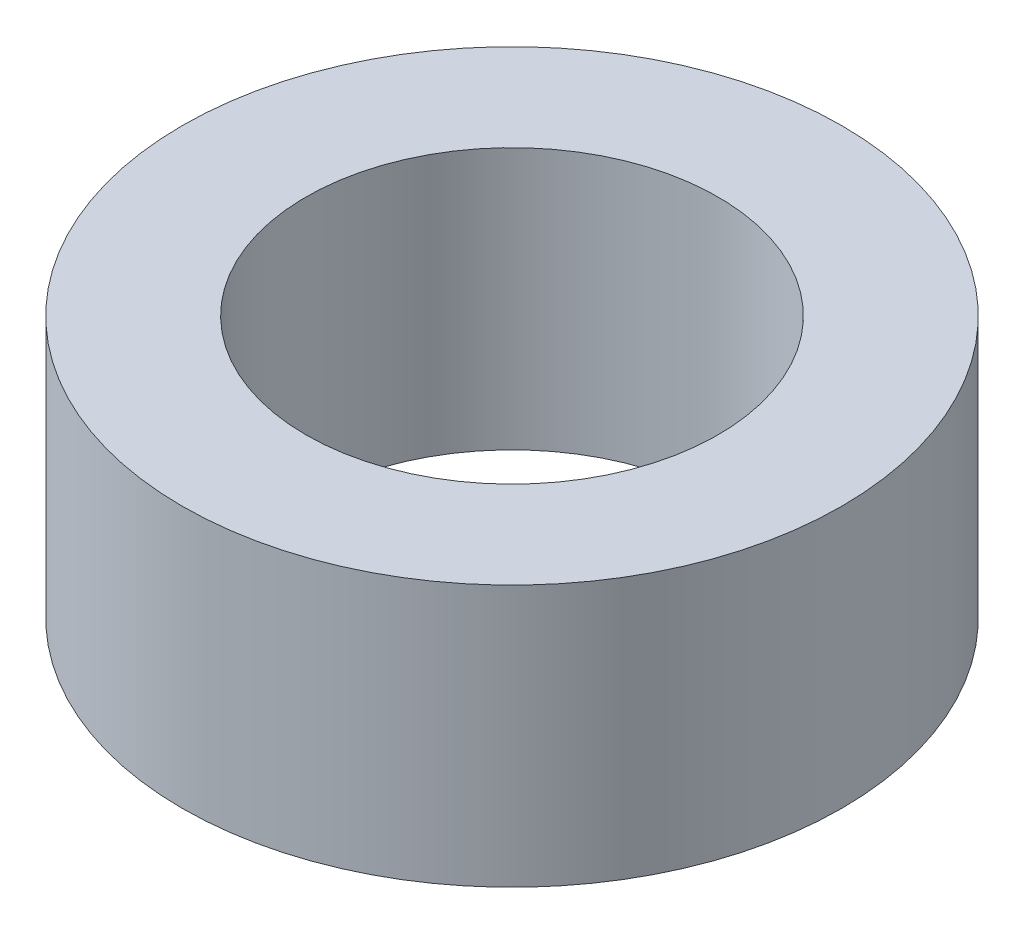
ISO-10303-21;
HEADER;
FILE_DESCRIPTION(('STEP AP214'),'2;1');
FILE_NAME('part.step','',(''),(''),'','','');
FILE_SCHEMA(('AUTOMOTIVE_DESIGN { 1 0 10303 214 1 1 1 1 }'));
ENDSEC;
DATA;
#1=APPLICATION_CONTEXT('core data for automotive mechanical design processes');
#2=APPLICATION_PROTOCOL_DEFINITION('international standard','automotive_design',2000,#1);
#3=PRODUCT_CONTEXT('',#1,'mechanical');
#4=PRODUCT('Part','Part','',(#3));
#5=PRODUCT_RELATED_PRODUCT_CATEGORY('part','',(#4));
#6=PRODUCT_DEFINITION_FORMATION('','',#4);
#7=PRODUCT_DEFINITION_CONTEXT('part definition',#1,'design');
#8=PRODUCT_DEFINITION('design','',#6,#7);
#9=PRODUCT_DEFINITION_SHAPE('','',#8);
#10=(LENGTH_UNIT() NAMED_UNIT(*) SI_UNIT(.MILLI.,.METRE.));
#11=(NAMED_UNIT(*) PLANE_ANGLE_UNIT() SI_UNIT($,.RADIAN.));
#12=(NAMED_UNIT(*) SI_UNIT($,.STERADIAN.) SOLID_ANGLE_UNIT());
#13=UNCERTAINTY_MEASURE_WITH_UNIT(LENGTH_MEASURE(1.E-05),#10,'distance_accuracy_value','');
#14=(GEOMETRIC_REPRESENTATION_CONTEXT(3) GLOBAL_UNCERTAINTY_ASSIGNED_CONTEXT((#13)) GLOBAL_UNIT_ASSIGNED_CONTEXT((#10,
#11,#12)) REPRESENTATION_CONTEXT('',''));
#15=CARTESIAN_POINT('',(0.,0.,0.));
#16=DIRECTION('',(0.,0.,1.));
#17=DIRECTION('',(1.,0.,0.));
#18=AXIS2_PLACEMENT_3D('',#15,#16,#17);
#19=CARTESIAN_POINT('',(0.,3.175,0.));
#20=DIRECTION('',(0.,1.,0.));
#21=DIRECTION('',(0.,0.,1.));
#22=AXIS2_PLACEMENT_3D('',#19,#20,#21);
#23=PLANE('',#22);
#24=CARTESIAN_POINT('',(0.,3.175,0.));
#25=DIRECTION('',(0.,1.,0.));
#26=DIRECTION('',(0.,0.,1.));
#27=AXIS2_PLACEMENT_3D('',#24,#25,#26);
#28=CIRCLE('',#27,4.);
#29=CARTESIAN_POINT('',(0.,3.175,4.));
#30=VERTEX_POINT('',#29);
#31=EDGE_CURVE('E10',#30,#30,#28,.T.);
#32=ORIENTED_EDGE('',*,*,#31,.T.);
#33=EDGE_LOOP('',(#32));
#34=FACE_BOUND('',#33,.T.);
#35=CARTESIAN_POINT('',(0.,3.175,0.));
#36=DIRECTION('',(0.,1.,0.));
#37=DIRECTION('',(0.,0.,1.));
#38=AXIS2_PLACEMENT_3D('',#35,#36,#37);
#39=CIRCLE('',#38,2.5);
#40=CARTESIAN_POINT('',(0.,3.175,2.5));
#41=VERTEX_POINT('',#40);
#42=EDGE_CURVE('E44',#41,#41,#39,.T.);
#43=ORIENTED_EDGE('',*,*,#42,.F.);
#44=EDGE_LOOP('',(#43));
#45=FACE_BOUND('',#44,.T.);
#46=ADVANCED_FACE('F33',(#34,#45),#23,.T.);
#47=CARTESIAN_POINT('',(0.,0.,0.));
#48=DIRECTION('',(0.,1.,0.));
#49=DIRECTION('',(0.,0.,1.));
#50=AXIS2_PLACEMENT_3D('',#47,#48,#49);
#51=PLANE('',#50);
#52=CARTESIAN_POINT('',(0.,0.,0.));
#53=DIRECTION('',(0.,1.,0.));
#54=DIRECTION('',(0.,0.,1.));
#55=AXIS2_PLACEMENT_3D('',#52,#53,#54);
#56=CIRCLE('',#55,4.);
#57=CARTESIAN_POINT('',(0.,0.,4.));
#58=VERTEX_POINT('',#57);
#59=EDGE_CURVE('E37',#58,#58,#56,.T.);
#60=ORIENTED_EDGE('',*,*,#59,.F.);
#61=EDGE_LOOP('',(#60));
#62=FACE_BOUND('',#61,.T.);
#63=CARTESIAN_POINT('',(0.,0.,0.));
#64=DIRECTION('',(0.,1.,0.));
#65=DIRECTION('',(0.,0.,1.));
#66=AXIS2_PLACEMENT_3D('',#63,#64,#65);
#67=CIRCLE('',#66,2.5);
#68=CARTESIAN_POINT('',(0.,0.,2.5));
#69=VERTEX_POINT('',#68);
#70=EDGE_CURVE('E46',#69,#69,#67,.T.);
#71=ORIENTED_EDGE('',*,*,#70,.T.);
#72=EDGE_LOOP('',(#71));
#73=FACE_BOUND('',#72,.T.);
#74=ADVANCED_FACE('F56',(#62,#73),#51,.F.);
#75=CARTESIAN_POINT('',(0.,3.175,0.));
#76=DIRECTION('',(0.,-1.,0.));
#77=DIRECTION('',(0.,0.,-1.));
#78=AXIS2_PLACEMENT_3D('',#75,#76,#77);
#79=CYLINDRICAL_SURFACE('',#78,4.);
#80=ORIENTED_EDGE('',*,*,#31,.F.);
#81=EDGE_LOOP('',(#80));
#82=FACE_BOUND('',#81,.T.);
#83=ORIENTED_EDGE('',*,*,#59,.T.);
#84=EDGE_LOOP('',(#83));
#85=FACE_BOUND('',#84,.T.);
#86=ADVANCED_FACE('F35',(#82,#85),#79,.T.);
#87=CARTESIAN_POINT('',(0.,3.175,0.));
#88=DIRECTION('',(0.,-1.,0.));
#89=DIRECTION('',(0.,0.,-1.));
#90=AXIS2_PLACEMENT_3D('',#87,#88,#89);
#91=CYLINDRICAL_SURFACE('',#90,2.5);
#92=ORIENTED_EDGE('',*,*,#42,.T.);
#93=EDGE_LOOP('',(#92));
#94=FACE_BOUND('',#93,.T.);
#95=ORIENTED_EDGE('',*,*,#70,.F.);
#96=EDGE_LOOP('',(#95));
#97=FACE_BOUND('',#96,.T.);
#98=ADVANCED_FACE('F52',(#94,#97),#91,.F.);
#99=CLOSED_SHELL('',(#46,#74,#86,#98));
#100=MANIFOLD_SOLID_BREP('B2',#99);
#101=ADVANCED_BREP_SHAPE_REPRESENTATION('',(#18,#100),#14);
#102=SHAPE_DEFINITION_REPRESENTATION(#9,#101);
ENDSEC;
END-ISO-10303-21;
